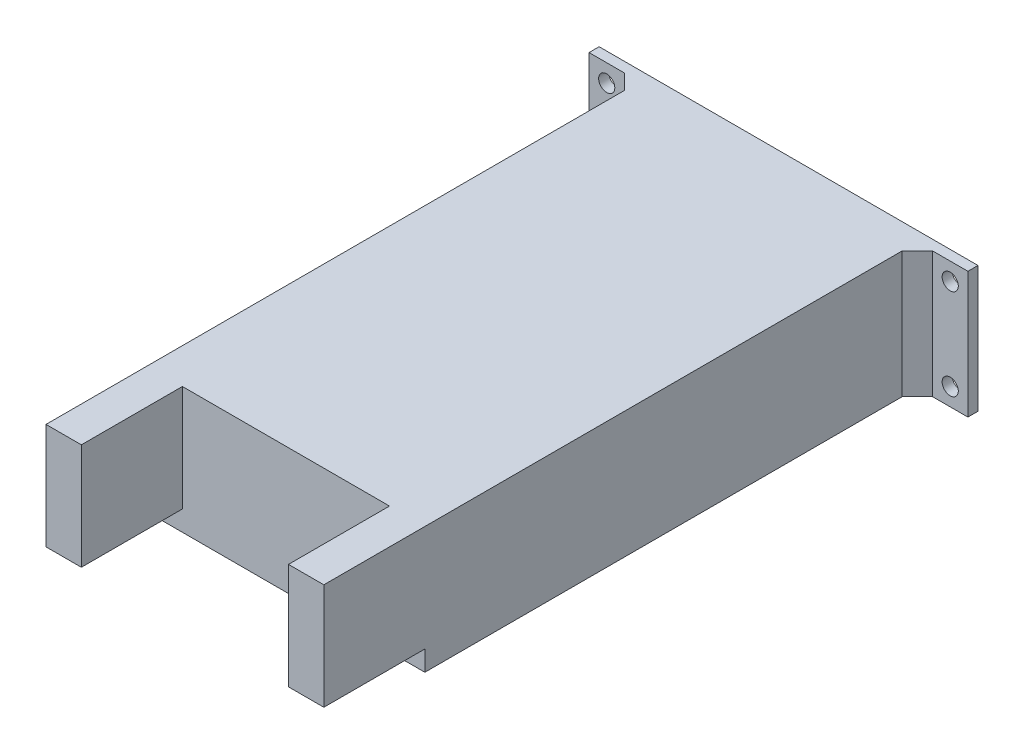
ISO-10303-21;
HEADER;
FILE_DESCRIPTION(('STEP AP214'),'2;1');
FILE_NAME('part.step','',(''),(''),'','','');
FILE_SCHEMA(('AUTOMOTIVE_DESIGN { 1 0 10303 214 1 1 1 1 }'));
ENDSEC;
DATA;
#1=APPLICATION_CONTEXT('core data for automotive mechanical design processes');
#2=APPLICATION_PROTOCOL_DEFINITION('international standard','automotive_design',2000,#1);
#3=PRODUCT_CONTEXT('',#1,'mechanical');
#4=PRODUCT('Part','Part','',(#3));
#5=PRODUCT_RELATED_PRODUCT_CATEGORY('part','',(#4));
#6=PRODUCT_DEFINITION_FORMATION('','',#4);
#7=PRODUCT_DEFINITION_CONTEXT('part definition',#1,'design');
#8=PRODUCT_DEFINITION('design','',#6,#7);
#9=PRODUCT_DEFINITION_SHAPE('','',#8);
#10=(LENGTH_UNIT() NAMED_UNIT(*) SI_UNIT(.MILLI.,.METRE.));
#11=(NAMED_UNIT(*) PLANE_ANGLE_UNIT() SI_UNIT($,.RADIAN.));
#12=(NAMED_UNIT(*) SI_UNIT($,.STERADIAN.) SOLID_ANGLE_UNIT());
#13=UNCERTAINTY_MEASURE_WITH_UNIT(LENGTH_MEASURE(1.E-05),#10,'distance_accuracy_value','');
#14=(GEOMETRIC_REPRESENTATION_CONTEXT(3) GLOBAL_UNCERTAINTY_ASSIGNED_CONTEXT((#13)) GLOBAL_UNIT_ASSIGNED_CONTEXT((#10,
#11,#12)) REPRESENTATION_CONTEXT('',''));
#15=CARTESIAN_POINT('',(0.,0.,0.));
#16=DIRECTION('',(0.,0.,1.));
#17=DIRECTION('',(1.,0.,0.));
#18=AXIS2_PLACEMENT_3D('',#15,#16,#17);
#19=CARTESIAN_POINT('',(0.,0.,119.5));
#20=DIRECTION('',(0.,0.,1.));
#21=DIRECTION('',(1.,0.,0.));
#22=AXIS2_PLACEMENT_3D('',#19,#20,#21);
#23=PLANE('',#22);
#24=DIRECTION('',(0.,1.,0.));
#25=VECTOR('',#24,1.);
#26=CARTESIAN_POINT('',(35.2710553804752,-15.8084677419355,119.5));
#27=LINE('',#26,#25);
#28=CARTESIAN_POINT('',(35.2710553804752,-15.8084677419355,119.5));
#29=VERTEX_POINT('',#28);
#30=CARTESIAN_POINT('',(35.2710553804752,5.19153225806452,119.5));
#31=VERTEX_POINT('',#30);
#32=EDGE_CURVE('E151',#29,#31,#27,.T.);
#33=ORIENTED_EDGE('',*,*,#32,.F.);
#34=DIRECTION('',(-1.,0.,0.));
#35=VECTOR('',#34,1.);
#36=CARTESIAN_POINT('',(42.2710553804752,-15.8084677419355,119.5));
#37=LINE('',#36,#35);
#38=CARTESIAN_POINT('',(42.2710553804752,-15.8084677419355,119.5));
#39=VERTEX_POINT('',#38);
#40=EDGE_CURVE('E185',#39,#29,#37,.T.);
#41=ORIENTED_EDGE('',*,*,#40,.F.);
#42=DIRECTION('',(0.,1.,0.));
#43=VECTOR('',#42,1.);
#44=CARTESIAN_POINT('',(42.2710553804752,5.19153225806452,119.5));
#45=LINE('',#44,#43);
#46=CARTESIAN_POINT('',(42.2710553804752,5.19153225806452,119.5));
#47=VERTEX_POINT('',#46);
#48=EDGE_CURVE('E279',#39,#47,#45,.T.);
#49=ORIENTED_EDGE('',*,*,#48,.T.);
#50=DIRECTION('',(-1.,0.,0.));
#51=VECTOR('',#50,1.);
#52=CARTESIAN_POINT('',(-12.7289446195248,5.19153225806452,119.5));
#53=LINE('',#52,#51);
#54=EDGE_CURVE('E283',#47,#31,#53,.T.);
#55=ORIENTED_EDGE('',*,*,#54,.T.);
#56=EDGE_LOOP('',(#33,#41,#49,#55));
#57=FACE_BOUND('',#56,.T.);
#58=ADVANCED_FACE('F33',(#57),#23,.T.);
#59=CARTESIAN_POINT('',(42.2710553804752,-15.8084677419355,99.5));
#60=DIRECTION('',(0.,1.,0.));
#61=DIRECTION('',(-1.,0.,0.));
#62=AXIS2_PLACEMENT_3D('',#59,#60,#61);
#63=PLANE('',#62);
#64=CARTESIAN_POINT('',(39.2710553804752,-15.8084677419355,114.5));
#65=DIRECTION('',(0.,-1.,0.));
#66=DIRECTION('',(1.,0.,0.));
#67=AXIS2_PLACEMENT_3D('',#64,#65,#66);
#68=CIRCLE('',#67,1.4);
#69=CARTESIAN_POINT('',(40.6710553804752,-15.8084677419355,114.5));
#70=VERTEX_POINT('',#69);
#71=EDGE_CURVE('E539',#70,#70,#68,.T.);
#72=ORIENTED_EDGE('',*,*,#71,.F.);
#73=EDGE_LOOP('',(#72));
#74=FACE_BOUND('',#73,.T.);
#75=CARTESIAN_POINT('',(39.2710553804752,-15.8084677419355,104.5));
#76=DIRECTION('',(0.,-1.,0.));
#77=DIRECTION('',(1.,0.,0.));
#78=AXIS2_PLACEMENT_3D('',#75,#76,#77);
#79=CIRCLE('',#78,1.4);
#80=CARTESIAN_POINT('',(40.6710553804752,-15.8084677419355,104.5));
#81=VERTEX_POINT('',#80);
#82=EDGE_CURVE('E544',#81,#81,#79,.T.);
#83=ORIENTED_EDGE('',*,*,#82,.F.);
#84=EDGE_LOOP('',(#83));
#85=FACE_BOUND('',#84,.T.);
#86=ORIENTED_EDGE('',*,*,#40,.T.);
#87=DIRECTION('',(0.,0.,1.));
#88=VECTOR('',#87,1.);
#89=CARTESIAN_POINT('',(35.2710553804752,-15.8084677419355,99.5));
#90=LINE('',#89,#88);
#91=CARTESIAN_POINT('',(35.2710553804752,-15.8084677419355,99.5));
#92=VERTEX_POINT('',#91);
#93=EDGE_CURVE('E175',#92,#29,#90,.T.);
#94=ORIENTED_EDGE('',*,*,#93,.F.);
#95=DIRECTION('',(-1.,0.,0.));
#96=VECTOR('',#95,1.);
#97=CARTESIAN_POINT('',(42.2710553804752,-15.8084677419355,99.5));
#98=LINE('',#97,#96);
#99=CARTESIAN_POINT('',(42.2710553804752,-15.8084677419355,99.5));
#100=VERTEX_POINT('',#99);
#101=EDGE_CURVE('E163',#100,#92,#98,.T.);
#102=ORIENTED_EDGE('',*,*,#101,.F.);
#103=DIRECTION('',(0.,0.,1.));
#104=VECTOR('',#103,1.);
#105=CARTESIAN_POINT('',(42.2710553804752,-15.8084677419355,99.5));
#106=LINE('',#105,#104);
#107=EDGE_CURVE('E56',#100,#39,#106,.T.);
#108=ORIENTED_EDGE('',*,*,#107,.T.);
#109=EDGE_LOOP('',(#86,#94,#102,#108));
#110=FACE_BOUND('',#109,.T.);
#111=ADVANCED_FACE('F312',(#74,#85,#110),#63,.F.);
#112=CARTESIAN_POINT('',(-12.7289446195248,-19.8084677419355,119.5));
#113=DIRECTION('',(0.,1.,0.));
#114=DIRECTION('',(0.,0.,1.));
#115=AXIS2_PLACEMENT_3D('',#112,#113,#114);
#116=PLANE('',#115);
#117=DIRECTION('',(-1.,0.,0.));
#118=VECTOR('',#117,1.);
#119=CARTESIAN_POINT('',(42.2710553804752,-19.8084677419355,99.5));
#120=LINE('',#119,#118);
#121=CARTESIAN_POINT('',(42.2710553804752,-19.8084677419355,99.5));
#122=VERTEX_POINT('',#121);
#123=CARTESIAN_POINT('',(-12.7289446195248,-19.8084677419355,99.5));
#124=VERTEX_POINT('',#123);
#125=EDGE_CURVE('E190',#122,#124,#120,.T.);
#126=ORIENTED_EDGE('',*,*,#125,.T.);
#127=DIRECTION('',(0.,0.,-1.));
#128=VECTOR('',#127,1.);
#129=CARTESIAN_POINT('',(-12.7289446195248,-19.8084677419355,119.5));
#130=LINE('',#129,#128);
#131=CARTESIAN_POINT('',(-12.7289446195248,-19.8084677419355,4.99999999999999));
#132=VERTEX_POINT('',#131);
#133=EDGE_CURVE('E11',#124,#132,#130,.T.);
#134=ORIENTED_EDGE('',*,*,#133,.T.);
#135=DIRECTION('',(-0.707106781186548,0.,-0.707106781186547));
#136=VECTOR('',#135,1.);
#137=CARTESIAN_POINT('',(-12.7289446195248,-19.8084677419355,5.));
#138=LINE('',#137,#136);
#139=CARTESIAN_POINT('',(-15.7289446195248,-19.8084677419355,2.));
#140=VERTEX_POINT('',#139);
#141=EDGE_CURVE('E208',#132,#140,#138,.T.);
#142=ORIENTED_EDGE('',*,*,#141,.T.);
#143=DIRECTION('',(1.,0.,0.));
#144=VECTOR('',#143,1.);
#145=CARTESIAN_POINT('',(-22.7289446195248,-19.8084677419355,2.));
#146=LINE('',#145,#144);
#147=CARTESIAN_POINT('',(-22.7289446195248,-19.8084677419355,2.));
#148=VERTEX_POINT('',#147);
#149=EDGE_CURVE('E235',#148,#140,#146,.T.);
#150=ORIENTED_EDGE('',*,*,#149,.F.);
#151=DIRECTION('',(0.,0.,1.));
#152=VECTOR('',#151,1.);
#153=CARTESIAN_POINT('',(-22.7289446195248,-19.8084677419355,0.));
#154=LINE('',#153,#152);
#155=CARTESIAN_POINT('',(-22.7289446195248,-19.8084677419355,0.));
#156=VERTEX_POINT('',#155);
#157=EDGE_CURVE('E225',#156,#148,#154,.T.);
#158=ORIENTED_EDGE('',*,*,#157,.F.);
#159=DIRECTION('',(1.,0.,0.));
#160=VECTOR('',#159,1.);
#161=CARTESIAN_POINT('',(-12.7289446195248,-19.8084677419355,0.));
#162=LINE('',#161,#160);
#163=CARTESIAN_POINT('',(52.2710553804752,-19.8084677419355,0.));
#164=VERTEX_POINT('',#163);
#165=EDGE_CURVE('E275',#156,#164,#162,.T.);
#166=ORIENTED_EDGE('',*,*,#165,.T.);
#167=DIRECTION('',(0.,0.,-1.));
#168=VECTOR('',#167,1.);
#169=CARTESIAN_POINT('',(52.2710553804752,-19.8084677419355,0.));
#170=LINE('',#169,#168);
#171=CARTESIAN_POINT('',(52.2710553804752,-19.8084677419355,2.));
#172=VERTEX_POINT('',#171);
#173=EDGE_CURVE('E267',#172,#164,#170,.T.);
#174=ORIENTED_EDGE('',*,*,#173,.F.);
#175=DIRECTION('',(-1.,0.,0.));
#176=VECTOR('',#175,1.);
#177=CARTESIAN_POINT('',(52.2710553804752,-19.8084677419355,2.));
#178=LINE('',#177,#176);
#179=CARTESIAN_POINT('',(45.2710553804752,-19.8084677419355,2.));
#180=VERTEX_POINT('',#179);
#181=EDGE_CURVE('E270',#172,#180,#178,.T.);
#182=ORIENTED_EDGE('',*,*,#181,.T.);
#183=DIRECTION('',(0.707106781186548,0.,-0.707106781186547));
#184=VECTOR('',#183,1.);
#185=CARTESIAN_POINT('',(42.2710553804752,-19.8084677419355,5.));
#186=LINE('',#185,#184);
#187=CARTESIAN_POINT('',(42.2710553804752,-19.8084677419355,4.99999999999998));
#188=VERTEX_POINT('',#187);
#189=EDGE_CURVE('E250',#188,#180,#186,.T.);
#190=ORIENTED_EDGE('',*,*,#189,.F.);
#191=DIRECTION('',(0.,0.,-1.));
#192=VECTOR('',#191,1.);
#193=CARTESIAN_POINT('',(42.2710553804752,-19.8084677419355,119.5));
#194=LINE('',#193,#192);
#195=EDGE_CURVE('E41',#122,#188,#194,.T.);
#196=ORIENTED_EDGE('',*,*,#195,.F.);
#197=EDGE_LOOP('',(#126,#134,#142,#150,#158,#166,#174,#182,#190,#196));
#198=FACE_BOUND('',#197,.T.);
#199=ADVANCED_FACE('F303',(#198),#116,.F.);
#200=CARTESIAN_POINT('',(-12.7289446195248,5.19153225806452,119.5));
#201=DIRECTION('',(1.,0.,0.));
#202=DIRECTION('',(0.,1.,0.));
#203=AXIS2_PLACEMENT_3D('',#200,#201,#202);
#204=PLANE('',#203);
#205=DIRECTION('',(0.,1.,0.));
#206=VECTOR('',#205,1.);
#207=CARTESIAN_POINT('',(-12.7289446195248,-19.8084677419355,99.5));
#208=LINE('',#207,#206);
#209=CARTESIAN_POINT('',(-12.7289446195248,-15.8084677419355,99.5));
#210=VERTEX_POINT('',#209);
#211=EDGE_CURVE('E187',#124,#210,#208,.T.);
#212=ORIENTED_EDGE('',*,*,#211,.T.);
#213=DIRECTION('',(0.,0.,1.));
#214=VECTOR('',#213,1.);
#215=CARTESIAN_POINT('',(-12.7289446195248,-15.8084677419355,99.5));
#216=LINE('',#215,#214);
#217=CARTESIAN_POINT('',(-12.7289446195248,-15.8084677419355,119.5));
#218=VERTEX_POINT('',#217);
#219=EDGE_CURVE('E194',#210,#218,#216,.T.);
#220=ORIENTED_EDGE('',*,*,#219,.T.);
#221=DIRECTION('',(0.,-1.,0.));
#222=VECTOR('',#221,1.);
#223=CARTESIAN_POINT('',(-12.7289446195248,5.19153225806452,119.5));
#224=LINE('',#223,#222);
#225=CARTESIAN_POINT('',(-12.7289446195248,5.19153225806452,119.5));
#226=VERTEX_POINT('',#225);
#227=EDGE_CURVE('E276',#226,#218,#224,.T.);
#228=ORIENTED_EDGE('',*,*,#227,.F.);
#229=DIRECTION('',(0.,0.,-1.));
#230=VECTOR('',#229,1.);
#231=CARTESIAN_POINT('',(-12.7289446195248,5.19153225806452,119.5));
#232=LINE('',#231,#230);
#233=CARTESIAN_POINT('',(-12.7289446195248,5.19153225806452,4.99999999999999));
#234=VERTEX_POINT('',#233);
#235=EDGE_CURVE('E285',#226,#234,#232,.T.);
#236=ORIENTED_EDGE('',*,*,#235,.T.);
#237=DIRECTION('',(0.,-1.,0.));
#238=VECTOR('',#237,1.);
#239=CARTESIAN_POINT('',(-12.7289446195248,5.19153225806452,5.));
#240=LINE('',#239,#238);
#241=EDGE_CURVE('E214',#234,#132,#240,.T.);
#242=ORIENTED_EDGE('',*,*,#241,.T.);
#243=ORIENTED_EDGE('',*,*,#133,.F.);
#244=EDGE_LOOP('',(#212,#220,#228,#236,#242,#243));
#245=FACE_BOUND('',#244,.T.);
#246=ADVANCED_FACE('F35',(#245),#204,.F.);
#247=CARTESIAN_POINT('',(42.2710553804752,5.19153225806452,119.5));
#248=DIRECTION('',(-1.,0.,0.));
#249=DIRECTION('',(0.,0.,1.));
#250=AXIS2_PLACEMENT_3D('',#247,#248,#249);
#251=PLANE('',#250);
#252=ORIENTED_EDGE('',*,*,#48,.F.);
#253=ORIENTED_EDGE('',*,*,#107,.F.);
#254=DIRECTION('',(0.,1.,0.));
#255=VECTOR('',#254,1.);
#256=CARTESIAN_POINT('',(42.2710553804752,-19.8084677419355,99.5));
#257=LINE('',#256,#255);
#258=EDGE_CURVE('E182',#122,#100,#257,.T.);
#259=ORIENTED_EDGE('',*,*,#258,.F.);
#260=ORIENTED_EDGE('',*,*,#195,.T.);
#261=DIRECTION('',(0.,1.,0.));
#262=VECTOR('',#261,1.);
#263=CARTESIAN_POINT('',(42.2710553804752,-19.8084677419355,5.));
#264=LINE('',#263,#262);
#265=CARTESIAN_POINT('',(42.2710553804752,5.19153225806452,4.99999999999998));
#266=VERTEX_POINT('',#265);
#267=EDGE_CURVE('E253',#188,#266,#264,.T.);
#268=ORIENTED_EDGE('',*,*,#267,.T.);
#269=DIRECTION('',(0.,0.,-1.));
#270=VECTOR('',#269,1.);
#271=CARTESIAN_POINT('',(42.2710553804752,5.19153225806452,119.5));
#272=LINE('',#271,#270);
#273=EDGE_CURVE('E289',#47,#266,#272,.T.);
#274=ORIENTED_EDGE('',*,*,#273,.F.);
#275=EDGE_LOOP('',(#252,#253,#259,#260,#268,#274));
#276=FACE_BOUND('',#275,.T.);
#277=ADVANCED_FACE('F296',(#276),#251,.F.);
#278=CARTESIAN_POINT('',(-12.7289446195248,5.19153225806452,119.5));
#279=DIRECTION('',(0.,-1.,0.));
#280=DIRECTION('',(0.,0.,-1.));
#281=AXIS2_PLACEMENT_3D('',#278,#279,#280);
#282=PLANE('',#281);
#283=DIRECTION('',(-1.,0.,0.));
#284=VECTOR('',#283,1.);
#285=CARTESIAN_POINT('',(35.2710553804752,5.19153225806452,99.5));
#286=LINE('',#285,#284);
#287=CARTESIAN_POINT('',(35.2710553804752,5.19153225806452,99.5));
#288=VERTEX_POINT('',#287);
#289=CARTESIAN_POINT('',(-5.72894461952479,5.19153225806452,99.5));
#290=VERTEX_POINT('',#289);
#291=EDGE_CURVE('E161',#288,#290,#286,.T.);
#292=ORIENTED_EDGE('',*,*,#291,.F.);
#293=DIRECTION('',(0.,0.,1.));
#294=VECTOR('',#293,1.);
#295=CARTESIAN_POINT('',(35.2710553804752,5.19153225806452,99.5));
#296=LINE('',#295,#294);
#297=EDGE_CURVE('E145',#288,#31,#296,.T.);
#298=ORIENTED_EDGE('',*,*,#297,.T.);
#299=ORIENTED_EDGE('',*,*,#54,.F.);
#300=ORIENTED_EDGE('',*,*,#273,.T.);
#301=DIRECTION('',(0.707106781186548,0.,-0.707106781186547));
#302=VECTOR('',#301,1.);
#303=CARTESIAN_POINT('',(42.2710553804752,5.19153225806452,5.));
#304=LINE('',#303,#302);
#305=CARTESIAN_POINT('',(45.2710553804752,5.19153225806452,2.));
#306=VERTEX_POINT('',#305);
#307=EDGE_CURVE('E247',#266,#306,#304,.T.);
#308=ORIENTED_EDGE('',*,*,#307,.T.);
#309=DIRECTION('',(-1.,0.,0.));
#310=VECTOR('',#309,1.);
#311=CARTESIAN_POINT('',(52.2710553804752,5.19153225806452,2.));
#312=LINE('',#311,#310);
#313=CARTESIAN_POINT('',(52.2710553804752,5.19153225806452,2.));
#314=VERTEX_POINT('',#313);
#315=EDGE_CURVE('E273',#314,#306,#312,.T.);
#316=ORIENTED_EDGE('',*,*,#315,.F.);
#317=DIRECTION('',(0.,0.,1.));
#318=VECTOR('',#317,1.);
#319=CARTESIAN_POINT('',(52.2710553804752,5.19153225806452,0.));
#320=LINE('',#319,#318);
#321=CARTESIAN_POINT('',(52.2710553804752,5.19153225806452,0.));
#322=VERTEX_POINT('',#321);
#323=EDGE_CURVE('E263',#322,#314,#320,.T.);
#324=ORIENTED_EDGE('',*,*,#323,.F.);
#325=DIRECTION('',(-1.,0.,0.));
#326=VECTOR('',#325,1.);
#327=CARTESIAN_POINT('',(-12.7289446195248,5.19153225806452,0.));
#328=LINE('',#327,#326);
#329=CARTESIAN_POINT('',(-22.7289446195248,5.19153225806452,0.));
#330=VERTEX_POINT('',#329);
#331=EDGE_CURVE('E280',#322,#330,#328,.T.);
#332=ORIENTED_EDGE('',*,*,#331,.T.);
#333=DIRECTION('',(0.,0.,-1.));
#334=VECTOR('',#333,1.);
#335=CARTESIAN_POINT('',(-22.7289446195248,5.19153225806452,0.));
#336=LINE('',#335,#334);
#337=CARTESIAN_POINT('',(-22.7289446195248,5.19153225806452,2.));
#338=VERTEX_POINT('',#337);
#339=EDGE_CURVE('E229',#338,#330,#336,.T.);
#340=ORIENTED_EDGE('',*,*,#339,.F.);
#341=DIRECTION('',(1.,0.,0.));
#342=VECTOR('',#341,1.);
#343=CARTESIAN_POINT('',(-22.7289446195248,5.19153225806452,2.));
#344=LINE('',#343,#342);
#345=CARTESIAN_POINT('',(-15.7289446195248,5.19153225806452,2.));
#346=VERTEX_POINT('',#345);
#347=EDGE_CURVE('E232',#338,#346,#344,.T.);
#348=ORIENTED_EDGE('',*,*,#347,.T.);
#349=DIRECTION('',(-0.707106781186548,0.,-0.707106781186547));
#350=VECTOR('',#349,1.);
#351=CARTESIAN_POINT('',(-12.7289446195248,5.19153225806452,5.));
#352=LINE('',#351,#350);
#353=EDGE_CURVE('E211',#234,#346,#352,.T.);
#354=ORIENTED_EDGE('',*,*,#353,.F.);
#355=ORIENTED_EDGE('',*,*,#235,.F.);
#356=CARTESIAN_POINT('',(-5.72894461952479,5.19153225806452,119.5));
#357=VERTEX_POINT('',#356);
#358=EDGE_CURVE('E282',#357,#226,#53,.T.);
#359=ORIENTED_EDGE('',*,*,#358,.F.);
#360=DIRECTION('',(0.,0.,1.));
#361=VECTOR('',#360,1.);
#362=CARTESIAN_POINT('',(-5.72894461952479,5.19153225806452,99.5));
#363=LINE('',#362,#361);
#364=EDGE_CURVE('E156',#290,#357,#363,.T.);
#365=ORIENTED_EDGE('',*,*,#364,.F.);
#366=EDGE_LOOP('',(#292,#298,#299,#300,#308,#316,#324,#332,#340,#348,#354,#355,#359,#365));
#367=FACE_BOUND('',#366,.T.);
#368=ADVANCED_FACE('F166',(#367),#282,.F.);
#369=DIRECTION('',(0.,-1.,0.));
#370=VECTOR('',#369,1.);
#371=CARTESIAN_POINT('',(-5.72894461952479,-15.8084677419355,119.5));
#372=LINE('',#371,#370);
#373=CARTESIAN_POINT('',(-5.72894461952479,-15.8084677419355,119.5));
#374=VERTEX_POINT('',#373);
#375=EDGE_CURVE('E164',#357,#374,#372,.T.);
#376=ORIENTED_EDGE('',*,*,#375,.F.);
#377=ORIENTED_EDGE('',*,*,#358,.T.);
#378=ORIENTED_EDGE('',*,*,#227,.T.);
#379=EDGE_CURVE('E177',#374,#218,#37,.T.);
#380=ORIENTED_EDGE('',*,*,#379,.F.);
#381=EDGE_LOOP('',(#376,#377,#378,#380));
#382=FACE_BOUND('',#381,.T.);
#383=ADVANCED_FACE('F341',(#382),#23,.T.);
#384=CARTESIAN_POINT('',(0.,0.,0.));
#385=DIRECTION('',(0.,0.,1.));
#386=DIRECTION('',(1.,0.,0.));
#387=AXIS2_PLACEMENT_3D('',#384,#385,#386);
#388=PLANE('',#387);
#389=CARTESIAN_POINT('',(-19.2289446195248,1.69153225806452,0.));
#390=DIRECTION('',(0.,0.,1.));
#391=DIRECTION('',(1.,0.,0.));
#392=AXIS2_PLACEMENT_3D('',#389,#390,#391);
#393=CIRCLE('',#392,1.6);
#394=CARTESIAN_POINT('',(-17.6289446195248,1.69153225806452,0.));
#395=VERTEX_POINT('',#394);
#396=EDGE_CURVE('E199',#395,#395,#393,.T.);
#397=ORIENTED_EDGE('',*,*,#396,.T.);
#398=EDGE_LOOP('',(#397));
#399=FACE_BOUND('',#398,.T.);
#400=CARTESIAN_POINT('',(-19.2289446195248,-16.3084677419355,0.));
#401=DIRECTION('',(0.,0.,1.));
#402=DIRECTION('',(1.,0.,0.));
#403=AXIS2_PLACEMENT_3D('',#400,#401,#402);
#404=CIRCLE('',#403,1.6);
#405=CARTESIAN_POINT('',(-17.6289446195248,-16.3084677419355,0.));
#406=VERTEX_POINT('',#405);
#407=EDGE_CURVE('E205',#406,#406,#404,.T.);
#408=ORIENTED_EDGE('',*,*,#407,.T.);
#409=EDGE_LOOP('',(#408));
#410=FACE_BOUND('',#409,.T.);
#411=CARTESIAN_POINT('',(48.7710553804752,-16.3084677419355,0.));
#412=DIRECTION('',(0.,0.,1.));
#413=DIRECTION('',(1.,0.,0.));
#414=AXIS2_PLACEMENT_3D('',#411,#412,#413);
#415=CIRCLE('',#414,1.6);
#416=CARTESIAN_POINT('',(50.3710553804752,-16.3084677419355,0.));
#417=VERTEX_POINT('',#416);
#418=EDGE_CURVE('E238',#417,#417,#415,.T.);
#419=ORIENTED_EDGE('',*,*,#418,.T.);
#420=EDGE_LOOP('',(#419));
#421=FACE_BOUND('',#420,.T.);
#422=CARTESIAN_POINT('',(48.7710553804752,1.69153225806452,0.));
#423=DIRECTION('',(0.,0.,1.));
#424=DIRECTION('',(1.,0.,0.));
#425=AXIS2_PLACEMENT_3D('',#422,#423,#424);
#426=CIRCLE('',#425,1.60000000000001);
#427=CARTESIAN_POINT('',(50.3710553804752,1.69153225806452,0.));
#428=VERTEX_POINT('',#427);
#429=EDGE_CURVE('E244',#428,#428,#426,.T.);
#430=ORIENTED_EDGE('',*,*,#429,.T.);
#431=EDGE_LOOP('',(#430));
#432=FACE_BOUND('',#431,.T.);
#433=ORIENTED_EDGE('',*,*,#165,.F.);
#434=DIRECTION('',(0.,-1.,0.));
#435=VECTOR('',#434,1.);
#436=CARTESIAN_POINT('',(-22.7289446195248,-19.8084677419355,0.));
#437=LINE('',#436,#435);
#438=EDGE_CURVE('E220',#330,#156,#437,.T.);
#439=ORIENTED_EDGE('',*,*,#438,.F.);
#440=ORIENTED_EDGE('',*,*,#331,.F.);
#441=DIRECTION('',(0.,1.,0.));
#442=VECTOR('',#441,1.);
#443=CARTESIAN_POINT('',(52.2710553804752,5.19153225806452,0.));
#444=LINE('',#443,#442);
#445=EDGE_CURVE('E259',#164,#322,#444,.T.);
#446=ORIENTED_EDGE('',*,*,#445,.F.);
#447=EDGE_LOOP('',(#433,#439,#440,#446));
#448=FACE_BOUND('',#447,.T.);
#449=ADVANCED_FACE('F333',(#399,#410,#421,#432,#448),#388,.F.);
#450=CARTESIAN_POINT('',(52.2710553804752,5.19153225806452,2.));
#451=DIRECTION('',(0.,0.,-1.));
#452=DIRECTION('',(0.,1.,0.));
#453=AXIS2_PLACEMENT_3D('',#450,#451,#452);
#454=PLANE('',#453);
#455=CARTESIAN_POINT('',(48.7710553804752,-16.3084677419355,2.));
#456=DIRECTION('',(0.,0.,1.));
#457=DIRECTION('',(1.,0.,0.));
#458=AXIS2_PLACEMENT_3D('',#455,#456,#457);
#459=CIRCLE('',#458,1.6);
#460=CARTESIAN_POINT('',(50.3710553804752,-16.3084677419355,2.));
#461=VERTEX_POINT('',#460);
#462=EDGE_CURVE('E237',#461,#461,#459,.T.);
#463=ORIENTED_EDGE('',*,*,#462,.F.);
#464=EDGE_LOOP('',(#463));
#465=FACE_BOUND('',#464,.T.);
#466=CARTESIAN_POINT('',(48.7710553804752,1.69153225806452,2.));
#467=DIRECTION('',(0.,0.,1.));
#468=DIRECTION('',(1.,0.,0.));
#469=AXIS2_PLACEMENT_3D('',#466,#467,#468);
#470=CIRCLE('',#469,1.60000000000001);
#471=CARTESIAN_POINT('',(50.3710553804752,1.69153225806452,2.));
#472=VERTEX_POINT('',#471);
#473=EDGE_CURVE('E241',#472,#472,#470,.T.);
#474=ORIENTED_EDGE('',*,*,#473,.F.);
#475=EDGE_LOOP('',(#474));
#476=FACE_BOUND('',#475,.T.);
#477=ORIENTED_EDGE('',*,*,#315,.T.);
#478=DIRECTION('',(0.,1.,0.));
#479=VECTOR('',#478,1.);
#480=CARTESIAN_POINT('',(45.2710553804752,-19.8084677419355,2.));
#481=LINE('',#480,#479);
#482=EDGE_CURVE('E256',#180,#306,#481,.T.);
#483=ORIENTED_EDGE('',*,*,#482,.F.);
#484=ORIENTED_EDGE('',*,*,#181,.F.);
#485=DIRECTION('',(0.,-1.,0.));
#486=VECTOR('',#485,1.);
#487=CARTESIAN_POINT('',(52.2710553804752,5.19153225806452,2.));
#488=LINE('',#487,#486);
#489=EDGE_CURVE('E265',#314,#172,#488,.T.);
#490=ORIENTED_EDGE('',*,*,#489,.F.);
#491=EDGE_LOOP('',(#477,#483,#484,#490));
#492=FACE_BOUND('',#491,.T.);
#493=ADVANCED_FACE('F308',(#465,#476,#492),#454,.F.);
#494=CARTESIAN_POINT('',(52.2710553804752,0.,0.));
#495=DIRECTION('',(-1.,0.,0.));
#496=DIRECTION('',(0.,0.,1.));
#497=AXIS2_PLACEMENT_3D('',#494,#495,#496);
#498=PLANE('',#497);
#499=ORIENTED_EDGE('',*,*,#445,.T.);
#500=ORIENTED_EDGE('',*,*,#323,.T.);
#501=ORIENTED_EDGE('',*,*,#489,.T.);
#502=ORIENTED_EDGE('',*,*,#173,.T.);
#503=EDGE_LOOP('',(#499,#500,#501,#502));
#504=FACE_BOUND('',#503,.T.);
#505=ADVANCED_FACE('F336',(#504),#498,.F.);
#506=CARTESIAN_POINT('',(42.2710553804752,-19.8084677419355,5.));
#507=DIRECTION('',(0.707106781186547,0.,0.707106781186548));
#508=DIRECTION('',(0.707106781186548,0.,-0.707106781186547));
#509=AXIS2_PLACEMENT_3D('',#506,#507,#508);
#510=PLANE('',#509);
#511=ORIENTED_EDGE('',*,*,#307,.F.);
#512=ORIENTED_EDGE('',*,*,#267,.F.);
#513=ORIENTED_EDGE('',*,*,#189,.T.);
#514=ORIENTED_EDGE('',*,*,#482,.T.);
#515=EDGE_LOOP('',(#511,#512,#513,#514));
#516=FACE_BOUND('',#515,.T.);
#517=ADVANCED_FACE('F302',(#516),#510,.T.);
#518=CARTESIAN_POINT('',(48.7710553804752,1.69153225806452,0.));
#519=DIRECTION('',(0.,0.,1.));
#520=DIRECTION('',(1.,0.,0.));
#521=AXIS2_PLACEMENT_3D('',#518,#519,#520);
#522=CYLINDRICAL_SURFACE('',#521,1.60000000000001);
#523=ORIENTED_EDGE('',*,*,#429,.F.);
#524=EDGE_LOOP('',(#523));
#525=FACE_BOUND('',#524,.T.);
#526=ORIENTED_EDGE('',*,*,#473,.T.);
#527=EDGE_LOOP('',(#526));
#528=FACE_BOUND('',#527,.T.);
#529=ADVANCED_FACE('F622',(#525,#528),#522,.F.);
#530=CARTESIAN_POINT('',(48.7710553804752,-16.3084677419355,0.));
#531=DIRECTION('',(0.,0.,1.));
#532=DIRECTION('',(1.,0.,0.));
#533=AXIS2_PLACEMENT_3D('',#530,#531,#532);
#534=CYLINDRICAL_SURFACE('',#533,1.6);
#535=ORIENTED_EDGE('',*,*,#418,.F.);
#536=EDGE_LOOP('',(#535));
#537=FACE_BOUND('',#536,.T.);
#538=ORIENTED_EDGE('',*,*,#462,.T.);
#539=EDGE_LOOP('',(#538));
#540=FACE_BOUND('',#539,.T.);
#541=ADVANCED_FACE('F591',(#537,#540),#534,.F.);
#542=CARTESIAN_POINT('',(-22.7289446195248,-19.8084677419355,2.));
#543=DIRECTION('',(0.,0.,-1.));
#544=DIRECTION('',(0.,1.,0.));
#545=AXIS2_PLACEMENT_3D('',#542,#543,#544);
#546=PLANE('',#545);
#547=CARTESIAN_POINT('',(-19.2289446195248,1.69153225806452,2.));
#548=DIRECTION('',(0.,0.,1.));
#549=DIRECTION('',(1.,0.,0.));
#550=AXIS2_PLACEMENT_3D('',#547,#548,#549);
#551=CIRCLE('',#550,1.6);
#552=CARTESIAN_POINT('',(-17.6289446195248,1.69153225806452,2.));
#553=VERTEX_POINT('',#552);
#554=EDGE_CURVE('E197',#553,#553,#551,.T.);
#555=ORIENTED_EDGE('',*,*,#554,.F.);
#556=EDGE_LOOP('',(#555));
#557=FACE_BOUND('',#556,.T.);
#558=CARTESIAN_POINT('',(-19.2289446195248,-16.3084677419355,2.));
#559=DIRECTION('',(0.,0.,1.));
#560=DIRECTION('',(1.,0.,0.));
#561=AXIS2_PLACEMENT_3D('',#558,#559,#560);
#562=CIRCLE('',#561,1.6);
#563=CARTESIAN_POINT('',(-17.6289446195248,-16.3084677419355,2.));
#564=VERTEX_POINT('',#563);
#565=EDGE_CURVE('E202',#564,#564,#562,.T.);
#566=ORIENTED_EDGE('',*,*,#565,.F.);
#567=EDGE_LOOP('',(#566));
#568=FACE_BOUND('',#567,.T.);
#569=ORIENTED_EDGE('',*,*,#149,.T.);
#570=DIRECTION('',(0.,-1.,0.));
#571=VECTOR('',#570,1.);
#572=CARTESIAN_POINT('',(-15.7289446195248,5.19153225806452,2.));
#573=LINE('',#572,#571);
#574=EDGE_CURVE('E217',#346,#140,#573,.T.);
#575=ORIENTED_EDGE('',*,*,#574,.F.);
#576=ORIENTED_EDGE('',*,*,#347,.F.);
#577=DIRECTION('',(0.,1.,0.));
#578=VECTOR('',#577,1.);
#579=CARTESIAN_POINT('',(-22.7289446195248,-19.8084677419355,2.));
#580=LINE('',#579,#578);
#581=EDGE_CURVE('E227',#148,#338,#580,.T.);
#582=ORIENTED_EDGE('',*,*,#581,.F.);
#583=EDGE_LOOP('',(#569,#575,#576,#582));
#584=FACE_BOUND('',#583,.T.);
#585=ADVANCED_FACE('F327',(#557,#568,#584),#546,.F.);
#586=CARTESIAN_POINT('',(-22.7289446195248,0.,0.));
#587=DIRECTION('',(1.,0.,0.));
#588=DIRECTION('',(0.,0.,-1.));
#589=AXIS2_PLACEMENT_3D('',#586,#587,#588);
#590=PLANE('',#589);
#591=ORIENTED_EDGE('',*,*,#438,.T.);
#592=ORIENTED_EDGE('',*,*,#157,.T.);
#593=ORIENTED_EDGE('',*,*,#581,.T.);
#594=ORIENTED_EDGE('',*,*,#339,.T.);
#595=EDGE_LOOP('',(#591,#592,#593,#594));
#596=FACE_BOUND('',#595,.T.);
#597=ADVANCED_FACE('F330',(#596),#590,.F.);
#598=CARTESIAN_POINT('',(-12.7289446195248,5.19153225806452,5.));
#599=DIRECTION('',(-0.707106781186547,0.,0.707106781186548));
#600=DIRECTION('',(0.707106781186548,0.,0.707106781186547));
#601=AXIS2_PLACEMENT_3D('',#598,#599,#600);
#602=PLANE('',#601);
#603=ORIENTED_EDGE('',*,*,#141,.F.);
#604=ORIENTED_EDGE('',*,*,#241,.F.);
#605=ORIENTED_EDGE('',*,*,#353,.T.);
#606=ORIENTED_EDGE('',*,*,#574,.T.);
#607=EDGE_LOOP('',(#603,#604,#605,#606));
#608=FACE_BOUND('',#607,.T.);
#609=ADVANCED_FACE('F321',(#608),#602,.T.);
#610=CARTESIAN_POINT('',(-19.2289446195248,-16.3084677419355,0.));
#611=DIRECTION('',(0.,0.,1.));
#612=DIRECTION('',(1.,0.,0.));
#613=AXIS2_PLACEMENT_3D('',#610,#611,#612);
#614=CYLINDRICAL_SURFACE('',#613,1.6);
#615=ORIENTED_EDGE('',*,*,#407,.F.);
#616=EDGE_LOOP('',(#615));
#617=FACE_BOUND('',#616,.T.);
#618=ORIENTED_EDGE('',*,*,#565,.T.);
#619=EDGE_LOOP('',(#618));
#620=FACE_BOUND('',#619,.T.);
#621=ADVANCED_FACE('F356',(#617,#620),#614,.F.);
#622=CARTESIAN_POINT('',(-19.2289446195248,1.69153225806452,0.));
#623=DIRECTION('',(0.,0.,1.));
#624=DIRECTION('',(1.,0.,0.));
#625=AXIS2_PLACEMENT_3D('',#622,#623,#624);
#626=CYLINDRICAL_SURFACE('',#625,1.6);
#627=ORIENTED_EDGE('',*,*,#396,.F.);
#628=EDGE_LOOP('',(#627));
#629=FACE_BOUND('',#628,.T.);
#630=ORIENTED_EDGE('',*,*,#554,.T.);
#631=EDGE_LOOP('',(#630));
#632=FACE_BOUND('',#631,.T.);
#633=ADVANCED_FACE('F348',(#629,#632),#626,.F.);
#634=CARTESIAN_POINT('',(-9.72894461952479,-15.8084677419355,114.5));
#635=DIRECTION('',(0.,-1.,0.));
#636=DIRECTION('',(1.,0.,0.));
#637=AXIS2_PLACEMENT_3D('',#634,#635,#636);
#638=CIRCLE('',#637,1.4);
#639=CARTESIAN_POINT('',(-8.32894461952479,-15.8084677419355,114.5));
#640=VERTEX_POINT('',#639);
#641=EDGE_CURVE('E530',#640,#640,#638,.T.);
#642=ORIENTED_EDGE('',*,*,#641,.F.);
#643=EDGE_LOOP('',(#642));
#644=FACE_BOUND('',#643,.T.);
#645=CARTESIAN_POINT('',(-9.72894461952479,-15.8084677419355,104.5));
#646=DIRECTION('',(0.,-1.,0.));
#647=DIRECTION('',(1.,0.,0.));
#648=AXIS2_PLACEMENT_3D('',#645,#646,#647);
#649=CIRCLE('',#648,1.4);
#650=CARTESIAN_POINT('',(-8.32894461952479,-15.8084677419355,104.5));
#651=VERTEX_POINT('',#650);
#652=EDGE_CURVE('E529',#651,#651,#649,.T.);
#653=ORIENTED_EDGE('',*,*,#652,.F.);
#654=EDGE_LOOP('',(#653));
#655=FACE_BOUND('',#654,.T.);
#656=CARTESIAN_POINT('',(-5.72894461952479,-15.8084677419355,99.5));
#657=VERTEX_POINT('',#656);
#658=EDGE_CURVE('E184',#657,#210,#98,.T.);
#659=ORIENTED_EDGE('',*,*,#658,.F.);
#660=DIRECTION('',(0.,0.,1.));
#661=VECTOR('',#660,1.);
#662=CARTESIAN_POINT('',(-5.72894461952479,-15.8084677419355,99.5));
#663=LINE('',#662,#661);
#664=EDGE_CURVE('E178',#657,#374,#663,.T.);
#665=ORIENTED_EDGE('',*,*,#664,.T.);
#666=ORIENTED_EDGE('',*,*,#379,.T.);
#667=ORIENTED_EDGE('',*,*,#219,.F.);
#668=EDGE_LOOP('',(#659,#665,#666,#667));
#669=FACE_BOUND('',#668,.T.);
#670=ADVANCED_FACE('F346',(#644,#655,#669),#63,.F.);
#671=CARTESIAN_POINT('',(0.,0.,99.5));
#672=DIRECTION('',(0.,0.,1.));
#673=DIRECTION('',(1.,0.,0.));
#674=AXIS2_PLACEMENT_3D('',#671,#672,#673);
#675=PLANE('',#674);
#676=ORIENTED_EDGE('',*,*,#258,.T.);
#677=ORIENTED_EDGE('',*,*,#101,.T.);
#678=DIRECTION('',(0.,1.,0.));
#679=VECTOR('',#678,1.);
#680=CARTESIAN_POINT('',(35.2710553804752,-15.8084677419355,99.5));
#681=LINE('',#680,#679);
#682=EDGE_CURVE('E148',#92,#288,#681,.T.);
#683=ORIENTED_EDGE('',*,*,#682,.T.);
#684=ORIENTED_EDGE('',*,*,#291,.T.);
#685=DIRECTION('',(0.,-1.,0.));
#686=VECTOR('',#685,1.);
#687=CARTESIAN_POINT('',(-5.72894461952479,-15.8084677419355,99.5));
#688=LINE('',#687,#686);
#689=EDGE_CURVE('E48',#290,#657,#688,.T.);
#690=ORIENTED_EDGE('',*,*,#689,.T.);
#691=ORIENTED_EDGE('',*,*,#658,.T.);
#692=ORIENTED_EDGE('',*,*,#211,.F.);
#693=ORIENTED_EDGE('',*,*,#125,.F.);
#694=EDGE_LOOP('',(#676,#677,#683,#684,#690,#691,#692,#693));
#695=FACE_BOUND('',#694,.T.);
#696=ADVANCED_FACE('F160',(#695),#675,.T.);
#697=CARTESIAN_POINT('',(35.2710553804752,-15.8084677419355,99.5));
#698=DIRECTION('',(1.,0.,0.));
#699=DIRECTION('',(0.,0.,-1.));
#700=AXIS2_PLACEMENT_3D('',#697,#698,#699);
#701=PLANE('',#700);
#702=ORIENTED_EDGE('',*,*,#32,.T.);
#703=ORIENTED_EDGE('',*,*,#297,.F.);
#704=ORIENTED_EDGE('',*,*,#682,.F.);
#705=ORIENTED_EDGE('',*,*,#93,.T.);
#706=EDGE_LOOP('',(#702,#703,#704,#705));
#707=FACE_BOUND('',#706,.T.);
#708=ADVANCED_FACE('F147',(#707),#701,.F.);
#709=CARTESIAN_POINT('',(-5.72894461952479,-15.8084677419355,99.5));
#710=DIRECTION('',(-1.,0.,0.));
#711=DIRECTION('',(0.,-1.,0.));
#712=AXIS2_PLACEMENT_3D('',#709,#710,#711);
#713=PLANE('',#712);
#714=ORIENTED_EDGE('',*,*,#375,.T.);
#715=ORIENTED_EDGE('',*,*,#664,.F.);
#716=ORIENTED_EDGE('',*,*,#689,.F.);
#717=ORIENTED_EDGE('',*,*,#364,.T.);
#718=EDGE_LOOP('',(#714,#715,#716,#717));
#719=FACE_BOUND('',#718,.T.);
#720=ADVANCED_FACE('F343',(#719),#713,.F.);
#721=CARTESIAN_POINT('',(39.2710553804752,-5.80846774193548,104.5));
#722=DIRECTION('',(0.,-1.,0.));
#723=DIRECTION('',(1.,0.,0.));
#724=AXIS2_PLACEMENT_3D('',#721,#722,#723);
#725=CYLINDRICAL_SURFACE('',#724,1.4);
#726=CARTESIAN_POINT('',(39.2710553804752,-5.80846774193548,104.5));
#727=DIRECTION('',(0.,-1.,0.));
#728=DIRECTION('',(1.,0.,0.));
#729=AXIS2_PLACEMENT_3D('',#726,#727,#728);
#730=CIRCLE('',#729,1.4);
#731=CARTESIAN_POINT('',(40.6710553804752,-5.80846774193548,104.5));
#732=VERTEX_POINT('',#731);
#733=EDGE_CURVE('E173',#732,#732,#730,.T.);
#734=ORIENTED_EDGE('',*,*,#733,.F.);
#735=EDGE_LOOP('',(#734));
#736=FACE_BOUND('',#735,.T.);
#737=ORIENTED_EDGE('',*,*,#82,.T.);
#738=EDGE_LOOP('',(#737));
#739=FACE_BOUND('',#738,.T.);
#740=ADVANCED_FACE('F433',(#736,#739),#725,.F.);
#741=CARTESIAN_POINT('',(39.2710553804752,-5.80846774193548,104.5));
#742=DIRECTION('',(0.,-1.,0.));
#743=DIRECTION('',(1.,0.,0.));
#744=AXIS2_PLACEMENT_3D('',#741,#742,#743);
#745=PLANE('',#744);
#746=ORIENTED_EDGE('',*,*,#733,.T.);
#747=EDGE_LOOP('',(#746));
#748=FACE_BOUND('',#747,.T.);
#749=ADVANCED_FACE('F447',(#748),#745,.T.);
#750=CARTESIAN_POINT('',(39.2710553804752,-5.80846774193548,114.5));
#751=DIRECTION('',(0.,-1.,0.));
#752=DIRECTION('',(1.,0.,0.));
#753=AXIS2_PLACEMENT_3D('',#750,#751,#752);
#754=CYLINDRICAL_SURFACE('',#753,1.4);
#755=CARTESIAN_POINT('',(39.2710553804752,-5.80846774193548,114.5));
#756=DIRECTION('',(0.,-1.,0.));
#757=DIRECTION('',(1.,0.,0.));
#758=AXIS2_PLACEMENT_3D('',#755,#756,#757);
#759=CIRCLE('',#758,1.4);
#760=CARTESIAN_POINT('',(40.6710553804752,-5.80846774193548,114.5));
#761=VERTEX_POINT('',#760);
#762=EDGE_CURVE('E541',#761,#761,#759,.T.);
#763=ORIENTED_EDGE('',*,*,#762,.F.);
#764=EDGE_LOOP('',(#763));
#765=FACE_BOUND('',#764,.T.);
#766=ORIENTED_EDGE('',*,*,#71,.T.);
#767=EDGE_LOOP('',(#766));
#768=FACE_BOUND('',#767,.T.);
#769=ADVANCED_FACE('F457',(#765,#768),#754,.F.);
#770=CARTESIAN_POINT('',(39.2710553804752,-5.80846774193548,114.5));
#771=DIRECTION('',(0.,-1.,0.));
#772=DIRECTION('',(1.,0.,0.));
#773=AXIS2_PLACEMENT_3D('',#770,#771,#772);
#774=PLANE('',#773);
#775=ORIENTED_EDGE('',*,*,#762,.T.);
#776=EDGE_LOOP('',(#775));
#777=FACE_BOUND('',#776,.T.);
#778=ADVANCED_FACE('F467',(#777),#774,.T.);
#779=CARTESIAN_POINT('',(-9.72894461952479,-5.80846774193549,104.5));
#780=DIRECTION('',(0.,-1.,0.));
#781=DIRECTION('',(1.,0.,0.));
#782=AXIS2_PLACEMENT_3D('',#779,#780,#781);
#783=CYLINDRICAL_SURFACE('',#782,1.4);
#784=CARTESIAN_POINT('',(-9.72894461952479,-5.80846774193549,104.5));
#785=DIRECTION('',(0.,-1.,0.));
#786=DIRECTION('',(1.,0.,0.));
#787=AXIS2_PLACEMENT_3D('',#784,#785,#786);
#788=CIRCLE('',#787,1.4);
#789=CARTESIAN_POINT('',(-8.32894461952479,-5.80846774193549,104.5));
#790=VERTEX_POINT('',#789);
#791=EDGE_CURVE('E533',#790,#790,#788,.T.);
#792=ORIENTED_EDGE('',*,*,#791,.F.);
#793=EDGE_LOOP('',(#792));
#794=FACE_BOUND('',#793,.T.);
#795=ORIENTED_EDGE('',*,*,#652,.T.);
#796=EDGE_LOOP('',(#795));
#797=FACE_BOUND('',#796,.T.);
#798=ADVANCED_FACE('F476',(#794,#797),#783,.F.);
#799=CARTESIAN_POINT('',(-9.72894461952479,-5.80846774193549,104.5));
#800=DIRECTION('',(0.,-1.,0.));
#801=DIRECTION('',(1.,0.,0.));
#802=AXIS2_PLACEMENT_3D('',#799,#800,#801);
#803=PLANE('',#802);
#804=ORIENTED_EDGE('',*,*,#791,.T.);
#805=EDGE_LOOP('',(#804));
#806=FACE_BOUND('',#805,.T.);
#807=ADVANCED_FACE('F492',(#806),#803,.T.);
#808=CARTESIAN_POINT('',(-9.72894461952479,-5.80846774193549,114.5));
#809=DIRECTION('',(0.,-1.,0.));
#810=DIRECTION('',(1.,0.,0.));
#811=AXIS2_PLACEMENT_3D('',#808,#809,#810);
#812=CYLINDRICAL_SURFACE('',#811,1.4);
#813=CARTESIAN_POINT('',(-9.72894461952479,-5.80846774193549,114.5));
#814=DIRECTION('',(0.,-1.,0.));
#815=DIRECTION('',(1.,0.,0.));
#816=AXIS2_PLACEMENT_3D('',#813,#814,#815);
#817=CIRCLE('',#816,1.4);
#818=CARTESIAN_POINT('',(-8.32894461952479,-5.80846774193549,114.5));
#819=VERTEX_POINT('',#818);
#820=EDGE_CURVE('E528',#819,#819,#817,.T.);
#821=ORIENTED_EDGE('',*,*,#820,.F.);
#822=EDGE_LOOP('',(#821));
#823=FACE_BOUND('',#822,.T.);
#824=ORIENTED_EDGE('',*,*,#641,.T.);
#825=EDGE_LOOP('',(#824));
#826=FACE_BOUND('',#825,.T.);
#827=ADVANCED_FACE('F502',(#823,#826),#812,.F.);
#828=CARTESIAN_POINT('',(-9.72894461952479,-5.80846774193549,114.5));
#829=DIRECTION('',(0.,-1.,0.));
#830=DIRECTION('',(1.,0.,0.));
#831=AXIS2_PLACEMENT_3D('',#828,#829,#830);
#832=PLANE('',#831);
#833=ORIENTED_EDGE('',*,*,#820,.T.);
#834=EDGE_LOOP('',(#833));
#835=FACE_BOUND('',#834,.T.);
#836=ADVANCED_FACE('F512',(#835),#832,.T.);
#837=CLOSED_SHELL('',(#58,#111,#199,#246,#277,#368,#383,#449,#493,#505,#517,#529,#541,#585,#597,
#609,#621,#633,#670,#696,#708,#720,#740,#749,#769,#778,#798,#807,#827,#836));
#838=MANIFOLD_SOLID_BREP('B2',#837);
#839=ADVANCED_BREP_SHAPE_REPRESENTATION('',(#18,#838),#14);
#840=SHAPE_DEFINITION_REPRESENTATION(#9,#839);
ENDSEC;
END-ISO-10303-21;
